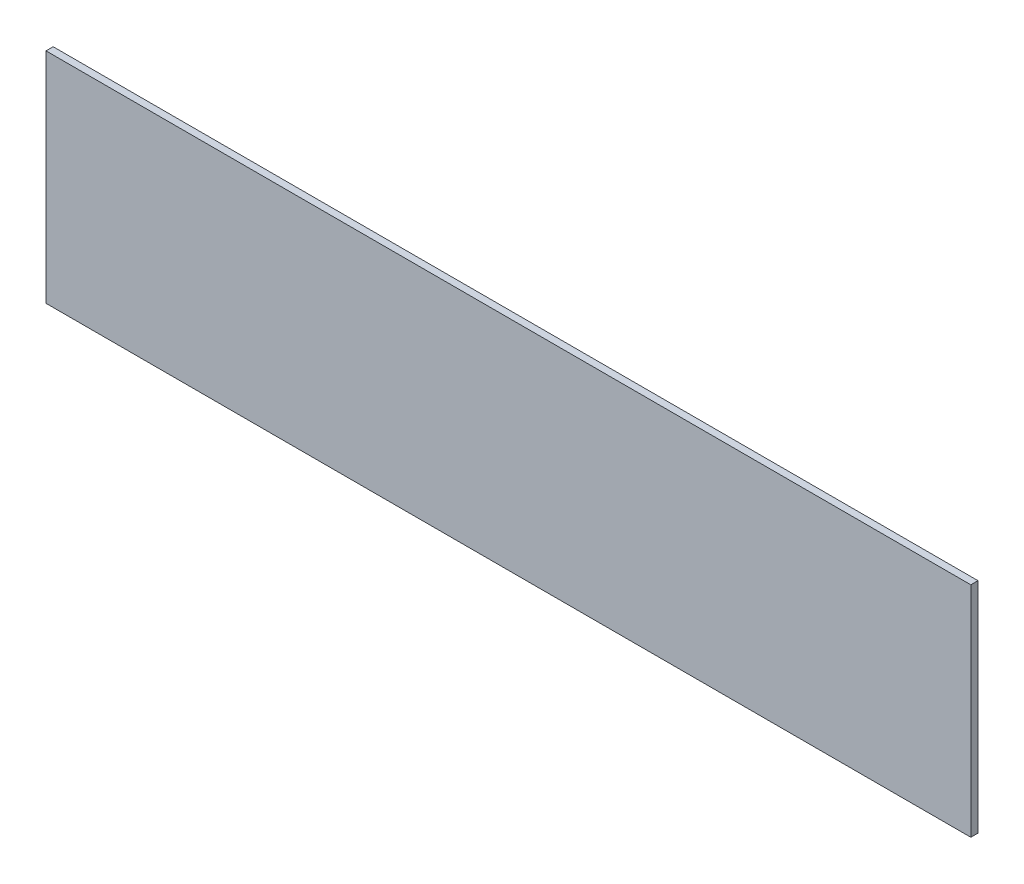
ISO-10303-21;
HEADER;
FILE_DESCRIPTION(('STEP AP214'),'2;1');
FILE_NAME('part.step','',(''),(''),'','','');
FILE_SCHEMA(('AUTOMOTIVE_DESIGN { 1 0 10303 214 1 1 1 1 }'));
ENDSEC;
DATA;
#1=APPLICATION_CONTEXT('core data for automotive mechanical design processes');
#2=APPLICATION_PROTOCOL_DEFINITION('international standard','automotive_design',2000,#1);
#3=PRODUCT_CONTEXT('',#1,'mechanical');
#4=PRODUCT('Part','Part','',(#3));
#5=PRODUCT_RELATED_PRODUCT_CATEGORY('part','',(#4));
#6=PRODUCT_DEFINITION_FORMATION('','',#4);
#7=PRODUCT_DEFINITION_CONTEXT('part definition',#1,'design');
#8=PRODUCT_DEFINITION('design','',#6,#7);
#9=PRODUCT_DEFINITION_SHAPE('','',#8);
#10=(LENGTH_UNIT() NAMED_UNIT(*) SI_UNIT(.MILLI.,.METRE.));
#11=(NAMED_UNIT(*) PLANE_ANGLE_UNIT() SI_UNIT($,.RADIAN.));
#12=(NAMED_UNIT(*) SI_UNIT($,.STERADIAN.) SOLID_ANGLE_UNIT());
#13=UNCERTAINTY_MEASURE_WITH_UNIT(LENGTH_MEASURE(1.E-05),#10,'distance_accuracy_value','');
#14=(GEOMETRIC_REPRESENTATION_CONTEXT(3) GLOBAL_UNCERTAINTY_ASSIGNED_CONTEXT((#13)) GLOBAL_UNIT_ASSIGNED_CONTEXT((#10,
#11,#12)) REPRESENTATION_CONTEXT('',''));
#15=CARTESIAN_POINT('',(0.,0.,0.));
#16=DIRECTION('',(0.,0.,1.));
#17=DIRECTION('',(1.,0.,0.));
#18=AXIS2_PLACEMENT_3D('',#15,#16,#17);
#19=CARTESIAN_POINT('',(258.,-61.,4.));
#20=DIRECTION('',(-1.,0.,0.));
#21=DIRECTION('',(0.,0.,1.));
#22=AXIS2_PLACEMENT_3D('',#19,#20,#21);
#23=PLANE('',#22);
#24=DIRECTION('',(0.,1.,0.));
#25=VECTOR('',#24,1.);
#26=CARTESIAN_POINT('',(258.,-61.,0.));
#27=LINE('',#26,#25);
#28=CARTESIAN_POINT('',(258.,-61.,0.));
#29=VERTEX_POINT('',#28);
#30=CARTESIAN_POINT('',(258.,61.,0.));
#31=VERTEX_POINT('',#30);
#32=EDGE_CURVE('E98',#29,#31,#27,.T.);
#33=ORIENTED_EDGE('',*,*,#32,.T.);
#34=DIRECTION('',(0.,0.,-1.));
#35=VECTOR('',#34,1.);
#36=CARTESIAN_POINT('',(258.,61.,4.));
#37=LINE('',#36,#35);
#38=CARTESIAN_POINT('',(258.,61.,4.));
#39=VERTEX_POINT('',#38);
#40=EDGE_CURVE('E11',#39,#31,#37,.T.);
#41=ORIENTED_EDGE('',*,*,#40,.F.);
#42=DIRECTION('',(0.,1.,0.));
#43=VECTOR('',#42,1.);
#44=CARTESIAN_POINT('',(258.,-61.,4.));
#45=LINE('',#44,#43);
#46=CARTESIAN_POINT('',(258.,-61.,4.));
#47=VERTEX_POINT('',#46);
#48=EDGE_CURVE('E84',#47,#39,#45,.T.);
#49=ORIENTED_EDGE('',*,*,#48,.F.);
#50=DIRECTION('',(0.,0.,-1.));
#51=VECTOR('',#50,1.);
#52=CARTESIAN_POINT('',(258.,-61.,4.));
#53=LINE('',#52,#51);
#54=EDGE_CURVE('E94',#47,#29,#53,.T.);
#55=ORIENTED_EDGE('',*,*,#54,.T.);
#56=EDGE_LOOP('',(#33,#41,#49,#55));
#57=FACE_BOUND('',#56,.T.);
#58=ADVANCED_FACE('F34',(#57),#23,.F.);
#59=CARTESIAN_POINT('',(-258.,61.,4.));
#60=DIRECTION('',(0.,-1.,0.));
#61=DIRECTION('',(0.,0.,-1.));
#62=AXIS2_PLACEMENT_3D('',#59,#60,#61);
#63=PLANE('',#62);
#64=DIRECTION('',(-1.,0.,0.));
#65=VECTOR('',#64,1.);
#66=CARTESIAN_POINT('',(-258.,61.,0.));
#67=LINE('',#66,#65);
#68=CARTESIAN_POINT('',(-258.,61.,0.));
#69=VERTEX_POINT('',#68);
#70=EDGE_CURVE('E89',#31,#69,#67,.T.);
#71=ORIENTED_EDGE('',*,*,#70,.T.);
#72=DIRECTION('',(0.,0.,-1.));
#73=VECTOR('',#72,1.);
#74=CARTESIAN_POINT('',(-258.,61.,4.));
#75=LINE('',#74,#73);
#76=CARTESIAN_POINT('',(-258.,61.,4.));
#77=VERTEX_POINT('',#76);
#78=EDGE_CURVE('E42',#77,#69,#75,.T.);
#79=ORIENTED_EDGE('',*,*,#78,.F.);
#80=DIRECTION('',(-1.,0.,0.));
#81=VECTOR('',#80,1.);
#82=CARTESIAN_POINT('',(-258.,61.,4.));
#83=LINE('',#82,#81);
#84=EDGE_CURVE('E78',#39,#77,#83,.T.);
#85=ORIENTED_EDGE('',*,*,#84,.F.);
#86=ORIENTED_EDGE('',*,*,#40,.T.);
#87=EDGE_LOOP('',(#71,#79,#85,#86));
#88=FACE_BOUND('',#87,.T.);
#89=ADVANCED_FACE('F88',(#88),#63,.F.);
#90=CARTESIAN_POINT('',(-258.,-61.,4.));
#91=DIRECTION('',(1.,0.,0.));
#92=DIRECTION('',(0.,0.,-1.));
#93=AXIS2_PLACEMENT_3D('',#90,#91,#92);
#94=PLANE('',#93);
#95=DIRECTION('',(0.,-1.,0.));
#96=VECTOR('',#95,1.);
#97=CARTESIAN_POINT('',(-258.,-61.,0.));
#98=LINE('',#97,#96);
#99=CARTESIAN_POINT('',(-258.,-61.,0.));
#100=VERTEX_POINT('',#99);
#101=EDGE_CURVE('E102',#69,#100,#98,.T.);
#102=ORIENTED_EDGE('',*,*,#101,.T.);
#103=DIRECTION('',(0.,0.,-1.));
#104=VECTOR('',#103,1.);
#105=CARTESIAN_POINT('',(-258.,-61.,4.));
#106=LINE('',#105,#104);
#107=CARTESIAN_POINT('',(-258.,-61.,4.));
#108=VERTEX_POINT('',#107);
#109=EDGE_CURVE('E91',#108,#100,#106,.T.);
#110=ORIENTED_EDGE('',*,*,#109,.F.);
#111=DIRECTION('',(0.,-1.,0.));
#112=VECTOR('',#111,1.);
#113=CARTESIAN_POINT('',(-258.,-61.,4.));
#114=LINE('',#113,#112);
#115=EDGE_CURVE('E81',#77,#108,#114,.T.);
#116=ORIENTED_EDGE('',*,*,#115,.F.);
#117=ORIENTED_EDGE('',*,*,#78,.T.);
#118=EDGE_LOOP('',(#102,#110,#116,#117));
#119=FACE_BOUND('',#118,.T.);
#120=ADVANCED_FACE('F92',(#119),#94,.F.);
#121=CARTESIAN_POINT('',(185.485837703549,-61.,4.));
#122=DIRECTION('',(0.,1.,0.));
#123=DIRECTION('',(0.,0.,1.));
#124=AXIS2_PLACEMENT_3D('',#121,#122,#123);
#125=PLANE('',#124);
#126=DIRECTION('',(1.,0.,0.));
#127=VECTOR('',#126,1.);
#128=CARTESIAN_POINT('',(185.485837703549,-61.,0.));
#129=LINE('',#128,#127);
#130=EDGE_CURVE('E67',#100,#29,#129,.T.);
#131=ORIENTED_EDGE('',*,*,#130,.T.);
#132=ORIENTED_EDGE('',*,*,#54,.F.);
#133=DIRECTION('',(1.,0.,0.));
#134=VECTOR('',#133,1.);
#135=CARTESIAN_POINT('',(-258.,-61.,4.));
#136=LINE('',#135,#134);
#137=EDGE_CURVE('E50',#108,#47,#136,.T.);
#138=ORIENTED_EDGE('',*,*,#137,.F.);
#139=ORIENTED_EDGE('',*,*,#109,.T.);
#140=EDGE_LOOP('',(#131,#132,#138,#139));
#141=FACE_BOUND('',#140,.T.);
#142=ADVANCED_FACE('F106',(#141),#125,.F.);
#143=CARTESIAN_POINT('',(0.,0.,4.));
#144=DIRECTION('',(0.,0.,-1.));
#145=DIRECTION('',(-1.,0.,0.));
#146=AXIS2_PLACEMENT_3D('',#143,#144,#145);
#147=PLANE('',#146);
#148=ORIENTED_EDGE('',*,*,#48,.T.);
#149=ORIENTED_EDGE('',*,*,#84,.T.);
#150=ORIENTED_EDGE('',*,*,#115,.T.);
#151=ORIENTED_EDGE('',*,*,#137,.T.);
#152=EDGE_LOOP('',(#148,#149,#150,#151));
#153=FACE_BOUND('',#152,.T.);
#154=ADVANCED_FACE('F79',(#153),#147,.F.);
#155=CARTESIAN_POINT('',(0.,0.,0.));
#156=DIRECTION('',(0.,0.,-1.));
#157=DIRECTION('',(-1.,0.,0.));
#158=AXIS2_PLACEMENT_3D('',#155,#156,#157);
#159=PLANE('',#158);
#160=ORIENTED_EDGE('',*,*,#32,.F.);
#161=ORIENTED_EDGE('',*,*,#130,.F.);
#162=ORIENTED_EDGE('',*,*,#101,.F.);
#163=ORIENTED_EDGE('',*,*,#70,.F.);
#164=EDGE_LOOP('',(#160,#161,#162,#163));
#165=FACE_BOUND('',#164,.T.);
#166=ADVANCED_FACE('F108',(#165),#159,.T.);
#167=CLOSED_SHELL('',(#58,#89,#120,#142,#154,#166));
#168=MANIFOLD_SOLID_BREP('B2',#167);
#169=ADVANCED_BREP_SHAPE_REPRESENTATION('',(#18,#168),#14);
#170=SHAPE_DEFINITION_REPRESENTATION(#9,#169);
ENDSEC;
END-ISO-10303-21;
